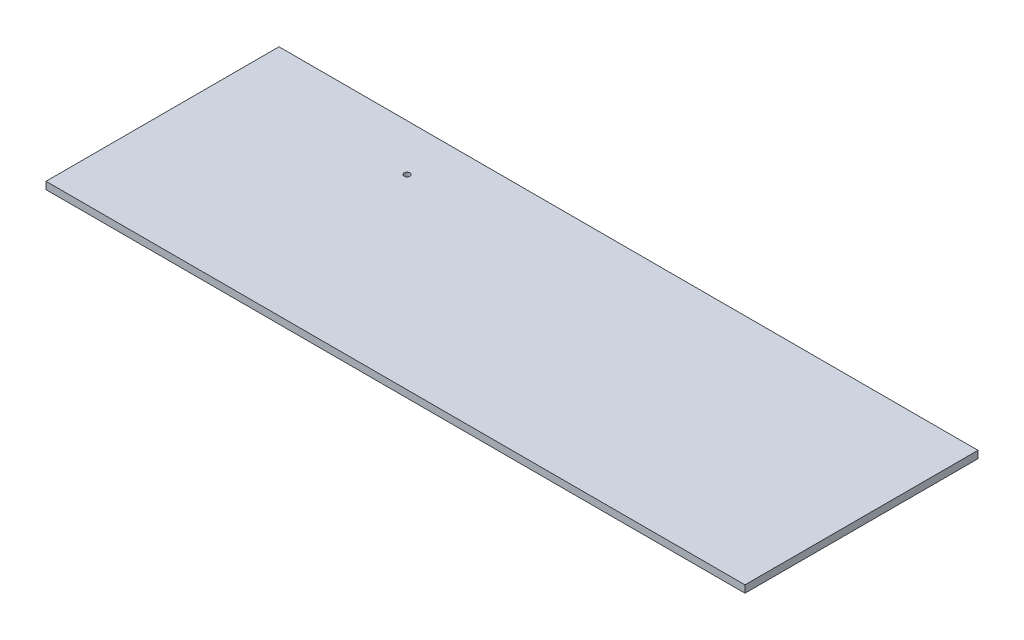
ISO-10303-21;
HEADER;
FILE_DESCRIPTION(('STEP AP214'),'2;1');
FILE_NAME('part.step','',(''),(''),'','','');
FILE_SCHEMA(('AUTOMOTIVE_DESIGN { 1 0 10303 214 1 1 1 1 }'));
ENDSEC;
DATA;
#1=APPLICATION_CONTEXT('core data for automotive mechanical design processes');
#2=APPLICATION_PROTOCOL_DEFINITION('international standard','automotive_design',2000,#1);
#3=PRODUCT_CONTEXT('',#1,'mechanical');
#4=PRODUCT('Part','Part','',(#3));
#5=PRODUCT_RELATED_PRODUCT_CATEGORY('part','',(#4));
#6=PRODUCT_DEFINITION_FORMATION('','',#4);
#7=PRODUCT_DEFINITION_CONTEXT('part definition',#1,'design');
#8=PRODUCT_DEFINITION('design','',#6,#7);
#9=PRODUCT_DEFINITION_SHAPE('','',#8);
#10=(LENGTH_UNIT() NAMED_UNIT(*) SI_UNIT(.MILLI.,.METRE.));
#11=(NAMED_UNIT(*) PLANE_ANGLE_UNIT() SI_UNIT($,.RADIAN.));
#12=(NAMED_UNIT(*) SI_UNIT($,.STERADIAN.) SOLID_ANGLE_UNIT());
#13=UNCERTAINTY_MEASURE_WITH_UNIT(LENGTH_MEASURE(1.E-05),#10,'distance_accuracy_value','');
#14=(GEOMETRIC_REPRESENTATION_CONTEXT(3) GLOBAL_UNCERTAINTY_ASSIGNED_CONTEXT((#13)) GLOBAL_UNIT_ASSIGNED_CONTEXT((#10,
#11,#12)) REPRESENTATION_CONTEXT('',''));
#15=CARTESIAN_POINT('',(0.,0.,0.));
#16=DIRECTION('',(0.,0.,1.));
#17=DIRECTION('',(1.,0.,0.));
#18=AXIS2_PLACEMENT_3D('',#15,#16,#17);
#19=CARTESIAN_POINT('',(0.,3.175,0.));
#20=DIRECTION('',(1.,0.,0.));
#21=DIRECTION('',(0.,0.,-1.));
#22=AXIS2_PLACEMENT_3D('',#19,#20,#21);
#23=PLANE('',#22);
#24=DIRECTION('',(0.,0.,1.));
#25=VECTOR('',#24,1.);
#26=CARTESIAN_POINT('',(0.,0.,0.));
#27=LINE('',#26,#25);
#28=CARTESIAN_POINT('',(0.,0.,0.));
#29=VERTEX_POINT('',#28);
#30=CARTESIAN_POINT('',(0.,0.,101.6));
#31=VERTEX_POINT('',#30);
#32=EDGE_CURVE('E98',#29,#31,#27,.T.);
#33=ORIENTED_EDGE('',*,*,#32,.T.);
#34=DIRECTION('',(0.,-1.,0.));
#35=VECTOR('',#34,1.);
#36=CARTESIAN_POINT('',(0.,3.175,101.6));
#37=LINE('',#36,#35);
#38=CARTESIAN_POINT('',(0.,3.175,101.6));
#39=VERTEX_POINT('',#38);
#40=EDGE_CURVE('E11',#39,#31,#37,.T.);
#41=ORIENTED_EDGE('',*,*,#40,.F.);
#42=DIRECTION('',(0.,0.,1.));
#43=VECTOR('',#42,1.);
#44=CARTESIAN_POINT('',(0.,3.175,0.));
#45=LINE('',#44,#43);
#46=CARTESIAN_POINT('',(0.,3.175,0.));
#47=VERTEX_POINT('',#46);
#48=EDGE_CURVE('E85',#47,#39,#45,.T.);
#49=ORIENTED_EDGE('',*,*,#48,.F.);
#50=DIRECTION('',(0.,-1.,0.));
#51=VECTOR('',#50,1.);
#52=CARTESIAN_POINT('',(0.,3.175,0.));
#53=LINE('',#52,#51);
#54=EDGE_CURVE('E94',#47,#29,#53,.T.);
#55=ORIENTED_EDGE('',*,*,#54,.T.);
#56=EDGE_LOOP('',(#33,#41,#49,#55));
#57=FACE_BOUND('',#56,.T.);
#58=ADVANCED_FACE('F33',(#57),#23,.F.);
#59=CARTESIAN_POINT('',(0.,3.175,101.6));
#60=DIRECTION('',(0.,0.,-1.));
#61=DIRECTION('',(-1.,0.,0.));
#62=AXIS2_PLACEMENT_3D('',#59,#60,#61);
#63=PLANE('',#62);
#64=DIRECTION('',(1.,0.,0.));
#65=VECTOR('',#64,1.);
#66=CARTESIAN_POINT('',(0.,0.,101.6));
#67=LINE('',#66,#65);
#68=CARTESIAN_POINT('',(304.8,0.,101.6));
#69=VERTEX_POINT('',#68);
#70=EDGE_CURVE('E89',#31,#69,#67,.T.);
#71=ORIENTED_EDGE('',*,*,#70,.T.);
#72=DIRECTION('',(0.,-1.,0.));
#73=VECTOR('',#72,1.);
#74=CARTESIAN_POINT('',(304.8,3.175,101.6));
#75=LINE('',#74,#73);
#76=CARTESIAN_POINT('',(304.8,3.175,101.6));
#77=VERTEX_POINT('',#76);
#78=EDGE_CURVE('E42',#77,#69,#75,.T.);
#79=ORIENTED_EDGE('',*,*,#78,.F.);
#80=DIRECTION('',(1.,0.,0.));
#81=VECTOR('',#80,1.);
#82=CARTESIAN_POINT('',(0.,3.175,101.6));
#83=LINE('',#82,#81);
#84=EDGE_CURVE('E80',#39,#77,#83,.T.);
#85=ORIENTED_EDGE('',*,*,#84,.F.);
#86=ORIENTED_EDGE('',*,*,#40,.T.);
#87=EDGE_LOOP('',(#71,#79,#85,#86));
#88=FACE_BOUND('',#87,.T.);
#89=ADVANCED_FACE('F88',(#88),#63,.F.);
#90=CARTESIAN_POINT('',(304.8,3.175,0.));
#91=DIRECTION('',(-1.,0.,0.));
#92=DIRECTION('',(0.,0.,1.));
#93=AXIS2_PLACEMENT_3D('',#90,#91,#92);
#94=PLANE('',#93);
#95=DIRECTION('',(0.,0.,-1.));
#96=VECTOR('',#95,1.);
#97=CARTESIAN_POINT('',(304.8,0.,0.));
#98=LINE('',#97,#96);
#99=CARTESIAN_POINT('',(304.8,0.,0.));
#100=VERTEX_POINT('',#99);
#101=EDGE_CURVE('E67',#69,#100,#98,.T.);
#102=ORIENTED_EDGE('',*,*,#101,.T.);
#103=DIRECTION('',(0.,-1.,0.));
#104=VECTOR('',#103,1.);
#105=CARTESIAN_POINT('',(304.8,3.175,0.));
#106=LINE('',#105,#104);
#107=CARTESIAN_POINT('',(304.8,3.175,0.));
#108=VERTEX_POINT('',#107);
#109=EDGE_CURVE('E90',#108,#100,#106,.T.);
#110=ORIENTED_EDGE('',*,*,#109,.F.);
#111=DIRECTION('',(0.,0.,-1.));
#112=VECTOR('',#111,1.);
#113=CARTESIAN_POINT('',(304.8,3.175,0.));
#114=LINE('',#113,#112);
#115=EDGE_CURVE('E83',#77,#108,#114,.T.);
#116=ORIENTED_EDGE('',*,*,#115,.F.);
#117=ORIENTED_EDGE('',*,*,#78,.T.);
#118=EDGE_LOOP('',(#102,#110,#116,#117));
#119=FACE_BOUND('',#118,.T.);
#120=ADVANCED_FACE('F92',(#119),#94,.F.);
#121=CARTESIAN_POINT('',(0.,3.175,0.));
#122=DIRECTION('',(0.,0.,1.));
#123=DIRECTION('',(1.,0.,0.));
#124=AXIS2_PLACEMENT_3D('',#121,#122,#123);
#125=PLANE('',#124);
#126=DIRECTION('',(-1.,0.,0.));
#127=VECTOR('',#126,1.);
#128=CARTESIAN_POINT('',(0.,0.,0.));
#129=LINE('',#128,#127);
#130=EDGE_CURVE('E73',#100,#29,#129,.T.);
#131=ORIENTED_EDGE('',*,*,#130,.T.);
#132=ORIENTED_EDGE('',*,*,#54,.F.);
#133=DIRECTION('',(-1.,0.,0.));
#134=VECTOR('',#133,1.);
#135=CARTESIAN_POINT('',(0.,3.175,0.));
#136=LINE('',#135,#134);
#137=EDGE_CURVE('E50',#108,#47,#136,.T.);
#138=ORIENTED_EDGE('',*,*,#137,.F.);
#139=ORIENTED_EDGE('',*,*,#109,.T.);
#140=EDGE_LOOP('',(#131,#132,#138,#139));
#141=FACE_BOUND('',#140,.T.);
#142=ADVANCED_FACE('F106',(#141),#125,.F.);
#143=CARTESIAN_POINT('',(0.,3.175,0.));
#144=DIRECTION('',(0.,1.,0.));
#145=DIRECTION('',(0.,0.,1.));
#146=AXIS2_PLACEMENT_3D('',#143,#144,#145);
#147=PLANE('',#146);
#148=CARTESIAN_POINT('',(76.2,3.175,20.32));
#149=DIRECTION('',(0.,1.,0.));
#150=DIRECTION('',(0.,0.,1.));
#151=AXIS2_PLACEMENT_3D('',#148,#149,#150);
#152=CIRCLE('',#151,1.26999999999999);
#153=CARTESIAN_POINT('',(76.2,3.175,21.59));
#154=VERTEX_POINT('',#153);
#155=EDGE_CURVE('E101',#154,#154,#152,.T.);
#156=ORIENTED_EDGE('',*,*,#155,.F.);
#157=EDGE_LOOP('',(#156));
#158=FACE_BOUND('',#157,.T.);
#159=ORIENTED_EDGE('',*,*,#48,.T.);
#160=ORIENTED_EDGE('',*,*,#84,.T.);
#161=ORIENTED_EDGE('',*,*,#115,.T.);
#162=ORIENTED_EDGE('',*,*,#137,.T.);
#163=EDGE_LOOP('',(#159,#160,#161,#162));
#164=FACE_BOUND('',#163,.T.);
#165=ADVANCED_FACE('F81',(#158,#164),#147,.T.);
#166=CARTESIAN_POINT('',(0.,0.,0.));
#167=DIRECTION('',(0.,1.,0.));
#168=DIRECTION('',(0.,0.,1.));
#169=AXIS2_PLACEMENT_3D('',#166,#167,#168);
#170=PLANE('',#169);
#171=CARTESIAN_POINT('',(76.2,0.,20.32));
#172=DIRECTION('',(0.,1.,0.));
#173=DIRECTION('',(0.,0.,1.));
#174=AXIS2_PLACEMENT_3D('',#171,#172,#173);
#175=CIRCLE('',#174,1.30285995366646);
#176=CARTESIAN_POINT('',(76.2,0.,21.6228599536665));
#177=VERTEX_POINT('',#176);
#178=EDGE_CURVE('E36',#177,#177,#175,.T.);
#179=ORIENTED_EDGE('',*,*,#178,.T.);
#180=EDGE_LOOP('',(#179));
#181=FACE_BOUND('',#180,.T.);
#182=ORIENTED_EDGE('',*,*,#32,.F.);
#183=ORIENTED_EDGE('',*,*,#130,.F.);
#184=ORIENTED_EDGE('',*,*,#101,.F.);
#185=ORIENTED_EDGE('',*,*,#70,.F.);
#186=EDGE_LOOP('',(#182,#183,#184,#185));
#187=FACE_BOUND('',#186,.T.);
#188=ADVANCED_FACE('F109',(#181,#187),#170,.F.);
#189=CARTESIAN_POINT('',(76.2,0.635,20.32));
#190=DIRECTION('',(0.,1.,0.));
#191=DIRECTION('',(0.,0.,1.));
#192=AXIS2_PLACEMENT_3D('',#189,#190,#191);
#193=CYLINDRICAL_SURFACE('',#192,1.26999999999999);
#194=CARTESIAN_POINT('',(76.2,0.635,20.32));
#195=DIRECTION('',(0.,1.,0.));
#196=DIRECTION('',(0.,0.,1.));
#197=AXIS2_PLACEMENT_3D('',#194,#195,#196);
#198=CIRCLE('',#197,1.26999999999999);
#199=CARTESIAN_POINT('',(76.2,0.635,21.59));
#200=VERTEX_POINT('',#199);
#201=EDGE_CURVE('E114',#200,#200,#198,.T.);
#202=ORIENTED_EDGE('',*,*,#201,.F.);
#203=EDGE_LOOP('',(#202));
#204=FACE_BOUND('',#203,.T.);
#205=ORIENTED_EDGE('',*,*,#155,.T.);
#206=EDGE_LOOP('',(#205));
#207=FACE_BOUND('',#206,.T.);
#208=ADVANCED_FACE('F128',(#204,#207),#193,.F.);
#209=CARTESIAN_POINT('',(76.2,-12.065,20.32));
#210=DIRECTION('',(0.,1.,0.));
#211=DIRECTION('',(0.,0.,1.));
#212=AXIS2_PLACEMENT_3D('',#209,#210,#211);
#213=CYLINDRICAL_SURFACE('',#212,1.30285995366646);
#214=CARTESIAN_POINT('',(76.2,0.635,20.32));
#215=DIRECTION('',(0.,1.,0.));
#216=DIRECTION('',(0.,0.,1.));
#217=AXIS2_PLACEMENT_3D('',#214,#215,#216);
#218=CIRCLE('',#217,1.30285995366646);
#219=CARTESIAN_POINT('',(76.2,0.635,21.6228599536665));
#220=VERTEX_POINT('',#219);
#221=EDGE_CURVE('E117',#220,#220,#218,.T.);
#222=CARTESIAN_POINT('',(76.2,0.635,21.6228599536665));
#223=CARTESIAN_POINT('',(76.2,0.628385416666667,21.6228599536665));
#224=CARTESIAN_POINT('',(76.2,0.621770833333334,21.6228599536665));
#225=CARTESIAN_POINT('',(76.2,0.608541666666667,21.6228599536665));
#226=CARTESIAN_POINT('',(76.2,0.601927083333334,21.6228599536665));
#227=CARTESIAN_POINT('',(76.2,0.588697916666667,21.6228599536665));
#228=CARTESIAN_POINT('',(76.2,0.582083333333334,21.6228599536665));
#229=CARTESIAN_POINT('',(76.2,0.568854166666667,21.6228599536665));
#230=CARTESIAN_POINT('',(76.2,0.562239583333334,21.6228599536665));
#231=CARTESIAN_POINT('',(76.2,0.549010416666667,21.6228599536665));
#232=CARTESIAN_POINT('',(76.2,0.542395833333334,21.6228599536665));
#233=CARTESIAN_POINT('',(76.2,0.529166666666667,21.6228599536665));
#234=CARTESIAN_POINT('',(76.2,0.522552083333334,21.6228599536665));
#235=CARTESIAN_POINT('',(76.2,0.509322916666668,21.6228599536665));
#236=CARTESIAN_POINT('',(76.2,0.502708333333334,21.6228599536665));
#237=CARTESIAN_POINT('',(76.2,0.489479166666668,21.6228599536665));
#238=CARTESIAN_POINT('',(76.2,0.482864583333334,21.6228599536665));
#239=CARTESIAN_POINT('',(76.2,0.469635416666667,21.6228599536665));
#240=CARTESIAN_POINT('',(76.2,0.463020833333333,21.6228599536665));
#241=CARTESIAN_POINT('',(76.2,0.449791666666666,21.6228599536665));
#242=CARTESIAN_POINT('',(76.2,0.443177083333333,21.6228599536665));
#243=CARTESIAN_POINT('',(76.2,0.429947916666666,21.6228599536665));
#244=CARTESIAN_POINT('',(76.2,0.423333333333333,21.6228599536665));
#245=CARTESIAN_POINT('',(76.2,0.410104166666666,21.6228599536665));
#246=CARTESIAN_POINT('',(76.2,0.403489583333333,21.6228599536665));
#247=CARTESIAN_POINT('',(76.2,0.390260416666666,21.6228599536665));
#248=CARTESIAN_POINT('',(76.2,0.383645833333333,21.6228599536665));
#249=CARTESIAN_POINT('',(76.2,0.370416666666666,21.6228599536665));
#250=CARTESIAN_POINT('',(76.2,0.363802083333333,21.6228599536665));
#251=CARTESIAN_POINT('',(76.2,0.350572916666667,21.6228599536665));
#252=CARTESIAN_POINT('',(76.2,0.343958333333333,21.6228599536665));
#253=CARTESIAN_POINT('',(76.2,0.330729166666667,21.6228599536665));
#254=CARTESIAN_POINT('',(76.2,0.324114583333333,21.6228599536665));
#255=CARTESIAN_POINT('',(76.2,0.310885416666667,21.6228599536665));
#256=CARTESIAN_POINT('',(76.2,0.304270833333333,21.6228599536665));
#257=CARTESIAN_POINT('',(76.2,0.291041666666667,21.6228599536665));
#258=CARTESIAN_POINT('',(76.2,0.284427083333334,21.6228599536665));
#259=CARTESIAN_POINT('',(76.2,0.271197916666667,21.6228599536665));
#260=CARTESIAN_POINT('',(76.2,0.264583333333334,21.6228599536665));
#261=CARTESIAN_POINT('',(76.2,0.251354166666667,21.6228599536665));
#262=CARTESIAN_POINT('',(76.2,0.244739583333334,21.6228599536665));
#263=CARTESIAN_POINT('',(76.2,0.231510416666667,21.6228599536665));
#264=CARTESIAN_POINT('',(76.2,0.224895833333334,21.6228599536665));
#265=CARTESIAN_POINT('',(76.2,0.211666666666667,21.6228599536665));
#266=CARTESIAN_POINT('',(76.2,0.205052083333334,21.6228599536665));
#267=CARTESIAN_POINT('',(76.2,0.191822916666667,21.6228599536665));
#268=CARTESIAN_POINT('',(76.2,0.185208333333334,21.6228599536665));
#269=CARTESIAN_POINT('',(76.2,0.171979166666667,21.6228599536665));
#270=CARTESIAN_POINT('',(76.2,0.165364583333333,21.6228599536665));
#271=CARTESIAN_POINT('',(76.2,0.152135416666666,21.6228599536665));
#272=CARTESIAN_POINT('',(76.2,0.145520833333333,21.6228599536665));
#273=CARTESIAN_POINT('',(76.2,0.132291666666666,21.6228599536665));
#274=CARTESIAN_POINT('',(76.2,0.125677083333333,21.6228599536665));
#275=CARTESIAN_POINT('',(76.2,0.112447916666666,21.6228599536665));
#276=CARTESIAN_POINT('',(76.2,0.105833333333333,21.6228599536665));
#277=CARTESIAN_POINT('',(76.2,0.0926041666666662,21.6228599536665));
#278=CARTESIAN_POINT('',(76.2,0.0859895833333329,21.6228599536665));
#279=CARTESIAN_POINT('',(76.2,0.0727604166666663,21.6228599536665));
#280=CARTESIAN_POINT('',(76.2,0.066145833333333,21.6228599536665));
#281=CARTESIAN_POINT('',(76.2,0.0529166666666664,21.6228599536665));
#282=CARTESIAN_POINT('',(76.2,0.0463020833333331,21.6228599536665));
#283=CARTESIAN_POINT('',(76.2,0.0330729166666665,21.6228599536665));
#284=CARTESIAN_POINT('',(76.2,0.0264583333333332,21.6228599536665));
#285=CARTESIAN_POINT('',(76.2,0.0132291666666666,21.6228599536665));
#286=CARTESIAN_POINT('',(76.2,0.0066145833333333,21.6228599536665));
#287=CARTESIAN_POINT('',(76.2,0.,21.6228599536665));
#288=B_SPLINE_CURVE_WITH_KNOTS('',3,(#222,#223,#224,#225,#226,#227,#228,#229,#230,#231,#232,
#233,#234,#235,#236,#237,#238,#239,#240,#241,#242,#243,#244,#245,#246,#247,#248,#249,#250,#251,
#252,#253,#254,#255,#256,#257,#258,#259,#260,#261,#262,#263,#264,#265,#266,#267,#268,#269,#270,
#271,#272,#273,#274,#275,#276,#277,#278,#279,#280,#281,#282,#283,#284,#285,#286,#287),
.UNSPECIFIED.,.F.,.F.,(4,2,2,2,2,2,2,2,2,2,2,2,2,2,2,2,2,2,2,2,2,2,2,2,2,2,2,2,2,2,2,2,4),(0.,
0.0198437499999999,0.0396874999999998,0.0595312499999997,0.0793749999999996,0.0992187499999995,
0.119062499999999,0.138906249999999,0.158749999999999,0.178593750000001,0.198437500000001,
0.218281250000001,0.238125,0.25796875,0.2778125,0.29765625,0.3175,0.33734375,0.3571875,
0.37703125,0.396875,0.41671875,0.436562499999999,0.456406249999999,0.476250000000001,
0.496093750000001,0.515937500000001,0.535781250000001,0.555625000000001,0.57546875,0.5953125,
0.61515625,0.635),.UNSPECIFIED.);
#289=EDGE_CURVE('BSEAM125',#220,#177,#288,.T.);
#290=ORIENTED_EDGE('',*,*,#221,.T.);
#291=ORIENTED_EDGE('',*,*,#178,.F.);
#292=ORIENTED_EDGE('',*,*,#289,.T.);
#293=ORIENTED_EDGE('',*,*,#289,.F.);
#294=EDGE_LOOP('',(#290,#292,#291,#293));
#295=FACE_BOUND('',#294,.T.);
#296=ADVANCED_FACE('F125',(#295),#213,.F.);
#297=CARTESIAN_POINT('',(76.2,0.635,20.32));
#298=DIRECTION('',(0.,1.,0.));
#299=DIRECTION('',(0.,0.,1.));
#300=AXIS2_PLACEMENT_3D('',#297,#298,#299);
#301=PLANE('',#300);
#302=ORIENTED_EDGE('',*,*,#201,.T.);
#303=EDGE_LOOP('',(#302));
#304=FACE_BOUND('',#303,.T.);
#305=ORIENTED_EDGE('',*,*,#221,.F.);
#306=EDGE_LOOP('',(#305));
#307=FACE_BOUND('',#306,.T.);
#308=ADVANCED_FACE('F127',(#304,#307),#301,.F.);
#309=CLOSED_SHELL('',(#58,#89,#120,#142,#165,#188,#208,#296,#308));
#310=MANIFOLD_SOLID_BREP('B2',#309);
#311=ADVANCED_BREP_SHAPE_REPRESENTATION('',(#18,#310),#14);
#312=SHAPE_DEFINITION_REPRESENTATION(#9,#311);
ENDSEC;
END-ISO-10303-21;
